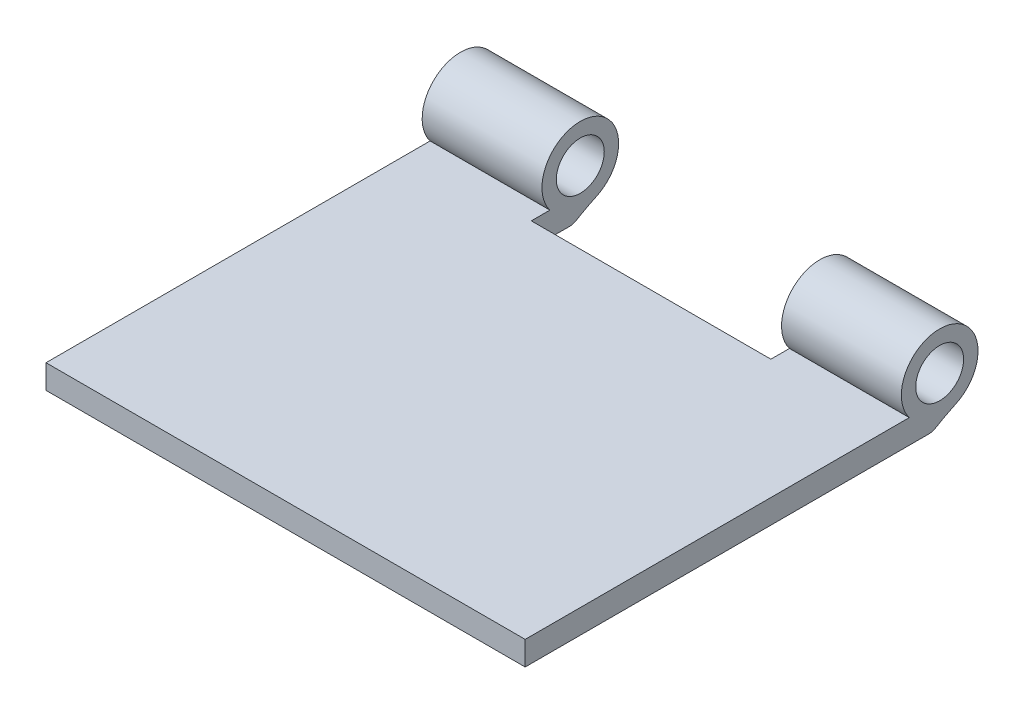
ISO-10303-21;
HEADER;
FILE_DESCRIPTION(('STEP AP214'),'2;1');
FILE_NAME('part.step','',(''),(''),'','','');
FILE_SCHEMA(('AUTOMOTIVE_DESIGN { 1 0 10303 214 1 1 1 1 }'));
ENDSEC;
DATA;
#1=APPLICATION_CONTEXT('core data for automotive mechanical design processes');
#2=APPLICATION_PROTOCOL_DEFINITION('international standard','automotive_design',2000,#1);
#3=PRODUCT_CONTEXT('',#1,'mechanical');
#4=PRODUCT('Part','Part','',(#3));
#5=PRODUCT_RELATED_PRODUCT_CATEGORY('part','',(#4));
#6=PRODUCT_DEFINITION_FORMATION('','',#4);
#7=PRODUCT_DEFINITION_CONTEXT('part definition',#1,'design');
#8=PRODUCT_DEFINITION('design','',#6,#7);
#9=PRODUCT_DEFINITION_SHAPE('','',#8);
#10=(LENGTH_UNIT() NAMED_UNIT(*) SI_UNIT(.MILLI.,.METRE.));
#11=(NAMED_UNIT(*) PLANE_ANGLE_UNIT() SI_UNIT($,.RADIAN.));
#12=(NAMED_UNIT(*) SI_UNIT($,.STERADIAN.) SOLID_ANGLE_UNIT());
#13=UNCERTAINTY_MEASURE_WITH_UNIT(LENGTH_MEASURE(1.E-05),#10,'distance_accuracy_value','');
#14=(GEOMETRIC_REPRESENTATION_CONTEXT(3) GLOBAL_UNCERTAINTY_ASSIGNED_CONTEXT((#13)) GLOBAL_UNIT_ASSIGNED_CONTEXT((#10,
#11,#12)) REPRESENTATION_CONTEXT('',''));
#15=CARTESIAN_POINT('',(0.,0.,0.));
#16=DIRECTION('',(0.,0.,1.));
#17=DIRECTION('',(1.,0.,0.));
#18=AXIS2_PLACEMENT_3D('',#15,#16,#17);
#19=CARTESIAN_POINT('',(0.,1.,0.));
#20=DIRECTION('',(0.,1.,0.));
#21=DIRECTION('',(0.,0.,1.));
#22=AXIS2_PLACEMENT_3D('',#19,#20,#21);
#23=PLANE('',#22);
#24=DIRECTION('',(1.,0.,0.));
#25=VECTOR('',#24,1.);
#26=CARTESIAN_POINT('',(-10.,1.,-7.53132478332535));
#27=LINE('',#26,#25);
#28=CARTESIAN_POINT('',(5.,1.,-7.53132478332535));
#29=VERTEX_POINT('',#28);
#30=CARTESIAN_POINT('',(10.,1.,-7.53132478332535));
#31=VERTEX_POINT('',#30);
#32=EDGE_CURVE('E200',#29,#31,#27,.T.);
#33=ORIENTED_EDGE('',*,*,#32,.F.);
#34=DIRECTION('',(0.,0.,1.));
#35=VECTOR('',#34,1.);
#36=CARTESIAN_POINT('',(5.,1.,0.));
#37=LINE('',#36,#35);
#38=CARTESIAN_POINT('',(5.,1.,-6.75512467054226));
#39=VERTEX_POINT('',#38);
#40=EDGE_CURVE('E162',#29,#39,#37,.T.);
#41=ORIENTED_EDGE('',*,*,#40,.T.);
#42=DIRECTION('',(-1.,0.,0.));
#43=VECTOR('',#42,1.);
#44=CARTESIAN_POINT('',(0.,1.,-6.75512467054226));
#45=LINE('',#44,#43);
#46=CARTESIAN_POINT('',(-5.,1.,-6.75512467054226));
#47=VERTEX_POINT('',#46);
#48=EDGE_CURVE('E168',#39,#47,#45,.T.);
#49=ORIENTED_EDGE('',*,*,#48,.T.);
#50=DIRECTION('',(0.,0.,-1.));
#51=VECTOR('',#50,1.);
#52=CARTESIAN_POINT('',(-5.,1.,0.));
#53=LINE('',#52,#51);
#54=CARTESIAN_POINT('',(-5.,1.,-7.53132478332535));
#55=VERTEX_POINT('',#54);
#56=EDGE_CURVE('E127',#47,#55,#53,.T.);
#57=ORIENTED_EDGE('',*,*,#56,.T.);
#58=CARTESIAN_POINT('',(-10.,1.,-7.53132478332535));
#59=VERTEX_POINT('',#58);
#60=EDGE_CURVE('E201',#59,#55,#27,.T.);
#61=ORIENTED_EDGE('',*,*,#60,.F.);
#62=DIRECTION('',(0.,0.,1.));
#63=VECTOR('',#62,1.);
#64=CARTESIAN_POINT('',(-10.,1.,-8.5));
#65=LINE('',#64,#63);
#66=CARTESIAN_POINT('',(-10.,1.,8.5));
#67=VERTEX_POINT('',#66);
#68=EDGE_CURVE('E185',#59,#67,#65,.T.);
#69=ORIENTED_EDGE('',*,*,#68,.T.);
#70=DIRECTION('',(1.,0.,0.));
#71=VECTOR('',#70,1.);
#72=CARTESIAN_POINT('',(-10.,1.,8.5));
#73=LINE('',#72,#71);
#74=CARTESIAN_POINT('',(10.,1.,8.5));
#75=VERTEX_POINT('',#74);
#76=EDGE_CURVE('E188',#67,#75,#73,.T.);
#77=ORIENTED_EDGE('',*,*,#76,.T.);
#78=DIRECTION('',(0.,0.,-1.));
#79=VECTOR('',#78,1.);
#80=CARTESIAN_POINT('',(10.,1.,-8.5));
#81=LINE('',#80,#79);
#82=EDGE_CURVE('E182',#75,#31,#81,.T.);
#83=ORIENTED_EDGE('',*,*,#82,.T.);
#84=EDGE_LOOP('',(#33,#41,#49,#57,#61,#69,#77,#83));
#85=FACE_BOUND('',#84,.T.);
#86=ADVANCED_FACE('F33',(#85),#23,.T.);
#87=CARTESIAN_POINT('',(0.,0.,0.));
#88=DIRECTION('',(0.,1.,0.));
#89=DIRECTION('',(0.,0.,1.));
#90=AXIS2_PLACEMENT_3D('',#87,#88,#89);
#91=PLANE('',#90);
#92=DIRECTION('',(0.,0.,-1.));
#93=VECTOR('',#92,1.);
#94=CARTESIAN_POINT('',(5.,0.,-16.859859008201));
#95=LINE('',#94,#93);
#96=CARTESIAN_POINT('',(5.,0.,-6.75512467054226));
#97=VERTEX_POINT('',#96);
#98=CARTESIAN_POINT('',(5.,0.,-8.361263217668));
#99=VERTEX_POINT('',#98);
#100=EDGE_CURVE('E144',#97,#99,#95,.T.);
#101=ORIENTED_EDGE('',*,*,#100,.T.);
#102=DIRECTION('',(-1.,0.,0.));
#103=VECTOR('',#102,1.);
#104=CARTESIAN_POINT('',(0.,0.,-8.361263217668));
#105=LINE('',#104,#103);
#106=CARTESIAN_POINT('',(10.,0.,-8.361263217668));
#107=VERTEX_POINT('',#106);
#108=EDGE_CURVE('E56',#99,#107,#105,.F.);
#109=ORIENTED_EDGE('',*,*,#108,.T.);
#110=DIRECTION('',(0.,0.,-1.));
#111=VECTOR('',#110,1.);
#112=CARTESIAN_POINT('',(10.,0.,-8.5));
#113=LINE('',#112,#111);
#114=CARTESIAN_POINT('',(10.,0.,8.5));
#115=VERTEX_POINT('',#114);
#116=EDGE_CURVE('E179',#115,#107,#113,.T.);
#117=ORIENTED_EDGE('',*,*,#116,.F.);
#118=DIRECTION('',(1.,0.,0.));
#119=VECTOR('',#118,1.);
#120=CARTESIAN_POINT('',(-10.,0.,8.5));
#121=LINE('',#120,#119);
#122=CARTESIAN_POINT('',(-10.,0.,8.5));
#123=VERTEX_POINT('',#122);
#124=EDGE_CURVE('E186',#123,#115,#121,.T.);
#125=ORIENTED_EDGE('',*,*,#124,.F.);
#126=DIRECTION('',(0.,0.,1.));
#127=VECTOR('',#126,1.);
#128=CARTESIAN_POINT('',(-10.,0.,-8.5));
#129=LINE('',#128,#127);
#130=CARTESIAN_POINT('',(-10.,0.,-8.361263217668));
#131=VERTEX_POINT('',#130);
#132=EDGE_CURVE('E192',#131,#123,#129,.T.);
#133=ORIENTED_EDGE('',*,*,#132,.F.);
#134=CARTESIAN_POINT('',(-5.,0.,-8.361263217668));
#135=VERTEX_POINT('',#134);
#136=EDGE_CURVE('E143',#131,#135,#105,.F.);
#137=ORIENTED_EDGE('',*,*,#136,.T.);
#138=DIRECTION('',(0.,0.,1.));
#139=VECTOR('',#138,1.);
#140=CARTESIAN_POINT('',(-5.,0.,-16.859859008201));
#141=LINE('',#140,#139);
#142=CARTESIAN_POINT('',(-5.,0.,-6.75512467054226));
#143=VERTEX_POINT('',#142);
#144=EDGE_CURVE('E48',#135,#143,#141,.T.);
#145=ORIENTED_EDGE('',*,*,#144,.T.);
#146=DIRECTION('',(1.,0.,0.));
#147=VECTOR('',#146,1.);
#148=CARTESIAN_POINT('',(-5.,0.,-6.75512467054226));
#149=LINE('',#148,#147);
#150=EDGE_CURVE('E134',#143,#97,#149,.T.);
#151=ORIENTED_EDGE('',*,*,#150,.T.);
#152=EDGE_LOOP('',(#101,#109,#117,#125,#133,#137,#145,#151));
#153=FACE_BOUND('',#152,.T.);
#154=ADVANCED_FACE('F140',(#153),#91,.F.);
#155=CARTESIAN_POINT('',(-10.,1.97441698705141,-8.80038409452623));
#156=DIRECTION('',(1.,0.,0.));
#157=DIRECTION('',(0.,0.,-1.));
#158=AXIS2_PLACEMENT_3D('',#155,#156,#157);
#159=CYLINDRICAL_SURFACE('',#158,1.6);
#160=DIRECTION('',(1.,0.,0.));
#161=VECTOR('',#160,1.);
#162=CARTESIAN_POINT('',(-10.,0.524878328822285,-9.47775967594269));
#163=LINE('',#162,#161);
#164=CARTESIAN_POINT('',(10.,0.524878328822284,-9.47775967594269));
#165=VERTEX_POINT('',#164);
#166=CARTESIAN_POINT('',(5.,0.524878328822285,-9.47775967594269));
#167=VERTEX_POINT('',#166);
#168=EDGE_CURVE('E205',#165,#167,#163,.F.);
#169=ORIENTED_EDGE('',*,*,#168,.T.);
#170=CARTESIAN_POINT('',(5.,1.97441698705141,-8.80038409452623));
#171=DIRECTION('',(-1.,0.,0.));
#172=DIRECTION('',(0.,0.,1.));
#173=AXIS2_PLACEMENT_3D('',#170,#171,#172);
#174=CIRCLE('',#173,1.6);
#175=EDGE_CURVE('E159',#167,#29,#174,.F.);
#176=ORIENTED_EDGE('',*,*,#175,.T.);
#177=ORIENTED_EDGE('',*,*,#32,.T.);
#178=CARTESIAN_POINT('',(10.,1.97441698705141,-8.80038409452623));
#179=DIRECTION('',(1.,0.,0.));
#180=DIRECTION('',(0.,0.,-1.));
#181=AXIS2_PLACEMENT_3D('',#178,#179,#180);
#182=CIRCLE('',#181,1.6);
#183=EDGE_CURVE('E174',#165,#31,#182,.T.);
#184=ORIENTED_EDGE('',*,*,#183,.F.);
#185=EDGE_LOOP('',(#169,#176,#177,#184));
#186=FACE_BOUND('',#185,.T.);
#187=ADVANCED_FACE('F259',(#186),#159,.T.);
#188=CARTESIAN_POINT('',(-5.,1.97441698705141,-8.80038409452623));
#189=DIRECTION('',(1.,0.,0.));
#190=DIRECTION('',(0.,0.,-1.));
#191=AXIS2_PLACEMENT_3D('',#188,#189,#190);
#192=CIRCLE('',#191,1.6);
#193=CARTESIAN_POINT('',(-5.,0.524878328822285,-9.47775967594269));
#194=VERTEX_POINT('',#193);
#195=EDGE_CURVE('E151',#55,#194,#192,.F.);
#196=ORIENTED_EDGE('',*,*,#195,.T.);
#197=CARTESIAN_POINT('',(-10.,0.524878328822285,-9.47775967594269));
#198=VERTEX_POINT('',#197);
#199=EDGE_CURVE('E204',#194,#198,#163,.F.);
#200=ORIENTED_EDGE('',*,*,#199,.T.);
#201=CARTESIAN_POINT('',(-10.,1.97441698705141,-8.80038409452623));
#202=DIRECTION('',(1.,0.,0.));
#203=DIRECTION('',(0.,0.,-1.));
#204=AXIS2_PLACEMENT_3D('',#201,#202,#203);
#205=CIRCLE('',#204,1.6);
#206=EDGE_CURVE('E177',#198,#59,#205,.T.);
#207=ORIENTED_EDGE('',*,*,#206,.T.);
#208=ORIENTED_EDGE('',*,*,#60,.T.);
#209=EDGE_LOOP('',(#196,#200,#207,#208));
#210=FACE_BOUND('',#209,.T.);
#211=ADVANCED_FACE('F232',(#210),#159,.T.);
#212=CARTESIAN_POINT('',(-10.,1.97441698705141,-8.80038409452623));
#213=DIRECTION('',(1.,0.,0.));
#214=DIRECTION('',(0.,0.,-1.));
#215=AXIS2_PLACEMENT_3D('',#212,#213,#214);
#216=CYLINDRICAL_SURFACE('',#215,1.);
#217=CARTESIAN_POINT('',(10.,1.97441698705141,-8.80038409452623));
#218=DIRECTION('',(1.,0.,0.));
#219=DIRECTION('',(0.,0.,-1.));
#220=AXIS2_PLACEMENT_3D('',#217,#218,#219);
#221=CIRCLE('',#220,1.);
#222=CARTESIAN_POINT('',(10.,1.97441698705141,-9.80038409452623));
#223=VERTEX_POINT('',#222);
#224=EDGE_CURVE('E170',#223,#223,#221,.T.);
#225=ORIENTED_EDGE('',*,*,#224,.T.);
#226=EDGE_LOOP('',(#225));
#227=FACE_BOUND('',#226,.T.);
#228=CARTESIAN_POINT('',(5.,1.97441698705141,-8.80038409452623));
#229=DIRECTION('',(-1.,0.,0.));
#230=DIRECTION('',(0.,0.,1.));
#231=AXIS2_PLACEMENT_3D('',#228,#229,#230);
#232=CIRCLE('',#231,1.);
#233=CARTESIAN_POINT('',(5.,1.97441698705141,-7.80038409452623));
#234=VERTEX_POINT('',#233);
#235=EDGE_CURVE('E165',#234,#234,#232,.F.);
#236=ORIENTED_EDGE('',*,*,#235,.F.);
#237=EDGE_LOOP('',(#236));
#238=FACE_BOUND('',#237,.T.);
#239=ADVANCED_FACE('F281',(#227,#238),#216,.F.);
#240=CARTESIAN_POINT('',(-10.,1.97441698705141,-8.80038409452623));
#241=DIRECTION('',(1.,0.,0.));
#242=DIRECTION('',(0.,0.,-1.));
#243=AXIS2_PLACEMENT_3D('',#240,#241,#242);
#244=CIRCLE('',#243,1.);
#245=CARTESIAN_POINT('',(-10.,1.97441698705141,-9.80038409452623));
#246=VERTEX_POINT('',#245);
#247=EDGE_CURVE('E171',#246,#246,#244,.T.);
#248=ORIENTED_EDGE('',*,*,#247,.F.);
#249=EDGE_LOOP('',(#248));
#250=FACE_BOUND('',#249,.T.);
#251=CARTESIAN_POINT('',(-5.,1.97441698705141,-8.80038409452623));
#252=DIRECTION('',(1.,0.,0.));
#253=DIRECTION('',(0.,0.,-1.));
#254=AXIS2_PLACEMENT_3D('',#251,#252,#253);
#255=CIRCLE('',#254,1.);
#256=CARTESIAN_POINT('',(-5.,1.97441698705141,-9.80038409452623));
#257=VERTEX_POINT('',#256);
#258=EDGE_CURVE('E154',#257,#257,#255,.F.);
#259=ORIENTED_EDGE('',*,*,#258,.F.);
#260=EDGE_LOOP('',(#259));
#261=FACE_BOUND('',#260,.T.);
#262=ADVANCED_FACE('F283',(#250,#261),#216,.F.);
#263=CARTESIAN_POINT('',(-10.,-8.53473828510978,-13.7113570597956));
#264=DIRECTION('',(-1.,0.,0.));
#265=DIRECTION('',(0.,0.,1.));
#266=AXIS2_PLACEMENT_3D('',#263,#264,#265);
#267=CYLINDRICAL_SURFACE('',#266,10.);
#268=CARTESIAN_POINT('',(5.,-8.53473828510978,-13.7113570597956));
#269=DIRECTION('',(-1.,0.,0.));
#270=DIRECTION('',(0.,0.,1.));
#271=AXIS2_PLACEMENT_3D('',#268,#269,#270);
#272=CIRCLE('',#271,10.);
#273=CARTESIAN_POINT('',(5.,0.0697743673757254,-8.61602959110265));
#274=VERTEX_POINT('',#273);
#275=EDGE_CURVE('E157',#167,#274,#272,.F.);
#276=ORIENTED_EDGE('',*,*,#275,.F.);
#277=ORIENTED_EDGE('',*,*,#168,.F.);
#278=CARTESIAN_POINT('',(10.,-8.53473828510978,-13.7113570597956));
#279=DIRECTION('',(-1.,0.,0.));
#280=DIRECTION('',(0.,0.,1.));
#281=AXIS2_PLACEMENT_3D('',#278,#279,#280);
#282=CIRCLE('',#281,10.);
#283=CARTESIAN_POINT('',(10.,0.0697743673757252,-8.61602959110265));
#284=VERTEX_POINT('',#283);
#285=EDGE_CURVE('E208',#284,#165,#282,.T.);
#286=ORIENTED_EDGE('',*,*,#285,.F.);
#287=DIRECTION('',(-1.,0.,0.));
#288=VECTOR('',#287,1.);
#289=CARTESIAN_POINT('',(-10.,0.0697743673757252,-8.61602959110265));
#290=LINE('',#289,#288);
#291=EDGE_CURVE('E214',#284,#274,#290,.T.);
#292=ORIENTED_EDGE('',*,*,#291,.T.);
#293=EDGE_LOOP('',(#276,#277,#286,#292));
#294=FACE_BOUND('',#293,.T.);
#295=ADVANCED_FACE('F257',(#294),#267,.F.);
#296=CARTESIAN_POINT('',(-5.,-8.53473828510978,-13.7113570597956));
#297=DIRECTION('',(1.,0.,0.));
#298=DIRECTION('',(0.,0.,-1.));
#299=AXIS2_PLACEMENT_3D('',#296,#297,#298);
#300=CIRCLE('',#299,10.);
#301=CARTESIAN_POINT('',(-5.,0.0697743673757254,-8.61602959110265));
#302=VERTEX_POINT('',#301);
#303=EDGE_CURVE('E130',#302,#194,#300,.F.);
#304=ORIENTED_EDGE('',*,*,#303,.F.);
#305=CARTESIAN_POINT('',(-10.,0.0697743673757252,-8.61602959110265));
#306=VERTEX_POINT('',#305);
#307=EDGE_CURVE('E213',#302,#306,#290,.T.);
#308=ORIENTED_EDGE('',*,*,#307,.T.);
#309=CARTESIAN_POINT('',(-10.,-8.53473828510978,-13.7113570597956));
#310=DIRECTION('',(1.,0.,0.));
#311=DIRECTION('',(0.,0.,-1.));
#312=AXIS2_PLACEMENT_3D('',#309,#310,#311);
#313=CIRCLE('',#312,10.);
#314=EDGE_CURVE('E210',#198,#306,#313,.T.);
#315=ORIENTED_EDGE('',*,*,#314,.F.);
#316=ORIENTED_EDGE('',*,*,#199,.F.);
#317=EDGE_LOOP('',(#304,#308,#315,#316));
#318=FACE_BOUND('',#317,.T.);
#319=ADVANCED_FACE('F228',(#318),#267,.F.);
#320=CARTESIAN_POINT('',(-10.,0.5,-8.361263217668));
#321=DIRECTION('',(-1.,0.,0.));
#322=DIRECTION('',(0.,0.,1.));
#323=AXIS2_PLACEMENT_3D('',#320,#321,#322);
#324=CYLINDRICAL_SURFACE('',#323,0.5);
#325=ORIENTED_EDGE('',*,*,#108,.F.);
#326=CARTESIAN_POINT('',(5.,0.5,-8.361263217668));
#327=DIRECTION('',(-1.,0.,0.));
#328=DIRECTION('',(0.,0.,1.));
#329=AXIS2_PLACEMENT_3D('',#326,#327,#328);
#330=CIRCLE('',#329,0.5);
#331=EDGE_CURVE('E11',#99,#274,#330,.F.);
#332=ORIENTED_EDGE('',*,*,#331,.T.);
#333=ORIENTED_EDGE('',*,*,#291,.F.);
#334=CARTESIAN_POINT('',(10.,0.5,-8.361263217668));
#335=DIRECTION('',(-1.,0.,0.));
#336=DIRECTION('',(0.,0.,1.));
#337=AXIS2_PLACEMENT_3D('',#334,#335,#336);
#338=CIRCLE('',#337,0.5);
#339=EDGE_CURVE('E220',#107,#284,#338,.F.);
#340=ORIENTED_EDGE('',*,*,#339,.F.);
#341=EDGE_LOOP('',(#325,#332,#333,#340));
#342=FACE_BOUND('',#341,.T.);
#343=ADVANCED_FACE('F35',(#342),#324,.T.);
#344=ORIENTED_EDGE('',*,*,#307,.F.);
#345=CARTESIAN_POINT('',(-5.,0.5,-8.361263217668));
#346=DIRECTION('',(1.,0.,0.));
#347=DIRECTION('',(0.,0.,-1.));
#348=AXIS2_PLACEMENT_3D('',#345,#346,#347);
#349=CIRCLE('',#348,0.5);
#350=EDGE_CURVE('E41',#302,#135,#349,.F.);
#351=ORIENTED_EDGE('',*,*,#350,.T.);
#352=ORIENTED_EDGE('',*,*,#136,.F.);
#353=CARTESIAN_POINT('',(-10.,0.5,-8.361263217668));
#354=DIRECTION('',(1.,0.,0.));
#355=DIRECTION('',(0.,0.,-1.));
#356=AXIS2_PLACEMENT_3D('',#353,#354,#355);
#357=CIRCLE('',#356,0.5);
#358=EDGE_CURVE('E217',#306,#131,#357,.F.);
#359=ORIENTED_EDGE('',*,*,#358,.F.);
#360=EDGE_LOOP('',(#344,#351,#352,#359));
#361=FACE_BOUND('',#360,.T.);
#362=ADVANCED_FACE('F223',(#361),#324,.T.);
#363=CARTESIAN_POINT('',(10.,1.,-8.5));
#364=DIRECTION('',(-1.,0.,0.));
#365=DIRECTION('',(0.,0.,1.));
#366=AXIS2_PLACEMENT_3D('',#363,#364,#365);
#367=PLANE('',#366);
#368=ORIENTED_EDGE('',*,*,#116,.T.);
#369=ORIENTED_EDGE('',*,*,#339,.T.);
#370=ORIENTED_EDGE('',*,*,#285,.T.);
#371=ORIENTED_EDGE('',*,*,#183,.T.);
#372=ORIENTED_EDGE('',*,*,#82,.F.);
#373=DIRECTION('',(0.,-1.,0.));
#374=VECTOR('',#373,1.);
#375=CARTESIAN_POINT('',(10.,1.,8.5));
#376=LINE('',#375,#374);
#377=EDGE_CURVE('E190',#75,#115,#376,.T.);
#378=ORIENTED_EDGE('',*,*,#377,.T.);
#379=EDGE_LOOP('',(#368,#369,#370,#371,#372,#378));
#380=FACE_BOUND('',#379,.T.);
#381=ORIENTED_EDGE('',*,*,#224,.F.);
#382=EDGE_LOOP('',(#381));
#383=FACE_BOUND('',#382,.T.);
#384=ADVANCED_FACE('F251',(#380,#383),#367,.F.);
#385=CARTESIAN_POINT('',(-10.,1.,-8.5));
#386=DIRECTION('',(1.,0.,0.));
#387=DIRECTION('',(0.,0.,-1.));
#388=AXIS2_PLACEMENT_3D('',#385,#386,#387);
#389=PLANE('',#388);
#390=ORIENTED_EDGE('',*,*,#314,.T.);
#391=ORIENTED_EDGE('',*,*,#358,.T.);
#392=ORIENTED_EDGE('',*,*,#132,.T.);
#393=DIRECTION('',(0.,-1.,0.));
#394=VECTOR('',#393,1.);
#395=CARTESIAN_POINT('',(-10.,1.,8.5));
#396=LINE('',#395,#394);
#397=EDGE_CURVE('E197',#67,#123,#396,.T.);
#398=ORIENTED_EDGE('',*,*,#397,.F.);
#399=ORIENTED_EDGE('',*,*,#68,.F.);
#400=ORIENTED_EDGE('',*,*,#206,.F.);
#401=EDGE_LOOP('',(#390,#391,#392,#398,#399,#400));
#402=FACE_BOUND('',#401,.T.);
#403=ORIENTED_EDGE('',*,*,#247,.T.);
#404=EDGE_LOOP('',(#403));
#405=FACE_BOUND('',#404,.T.);
#406=ADVANCED_FACE('F236',(#402,#405),#389,.F.);
#407=CARTESIAN_POINT('',(-10.,1.,8.5));
#408=DIRECTION('',(0.,0.,-1.));
#409=DIRECTION('',(-1.,0.,0.));
#410=AXIS2_PLACEMENT_3D('',#407,#408,#409);
#411=PLANE('',#410);
#412=ORIENTED_EDGE('',*,*,#124,.T.);
#413=ORIENTED_EDGE('',*,*,#377,.F.);
#414=ORIENTED_EDGE('',*,*,#76,.F.);
#415=ORIENTED_EDGE('',*,*,#397,.T.);
#416=EDGE_LOOP('',(#412,#413,#414,#415));
#417=FACE_BOUND('',#416,.T.);
#418=ADVANCED_FACE('F263',(#417),#411,.F.);
#419=CARTESIAN_POINT('',(5.,3.57441698705142,-16.859859008201));
#420=DIRECTION('',(-1.,0.,0.));
#421=DIRECTION('',(0.,0.,1.));
#422=AXIS2_PLACEMENT_3D('',#419,#420,#421);
#423=PLANE('',#422);
#424=ORIENTED_EDGE('',*,*,#175,.F.);
#425=ORIENTED_EDGE('',*,*,#275,.T.);
#426=ORIENTED_EDGE('',*,*,#331,.F.);
#427=ORIENTED_EDGE('',*,*,#100,.F.);
#428=DIRECTION('',(0.,-1.,0.));
#429=VECTOR('',#428,1.);
#430=CARTESIAN_POINT('',(5.,3.57441698705142,-6.75512467054226));
#431=LINE('',#430,#429);
#432=EDGE_CURVE('E131',#39,#97,#431,.T.);
#433=ORIENTED_EDGE('',*,*,#432,.F.);
#434=ORIENTED_EDGE('',*,*,#40,.F.);
#435=EDGE_LOOP('',(#424,#425,#426,#427,#433,#434));
#436=FACE_BOUND('',#435,.T.);
#437=ORIENTED_EDGE('',*,*,#235,.T.);
#438=EDGE_LOOP('',(#437));
#439=FACE_BOUND('',#438,.T.);
#440=ADVANCED_FACE('F244',(#436,#439),#423,.T.);
#441=CARTESIAN_POINT('',(-5.,3.57441698705142,-16.859859008201));
#442=DIRECTION('',(1.,0.,0.));
#443=DIRECTION('',(0.,0.,-1.));
#444=AXIS2_PLACEMENT_3D('',#441,#442,#443);
#445=PLANE('',#444);
#446=DIRECTION('',(0.,-1.,0.));
#447=VECTOR('',#446,1.);
#448=CARTESIAN_POINT('',(-5.,3.57441698705142,-6.75512467054226));
#449=LINE('',#448,#447);
#450=EDGE_CURVE('E122',#47,#143,#449,.T.);
#451=ORIENTED_EDGE('',*,*,#450,.T.);
#452=ORIENTED_EDGE('',*,*,#144,.F.);
#453=ORIENTED_EDGE('',*,*,#350,.F.);
#454=ORIENTED_EDGE('',*,*,#303,.T.);
#455=ORIENTED_EDGE('',*,*,#195,.F.);
#456=ORIENTED_EDGE('',*,*,#56,.F.);
#457=EDGE_LOOP('',(#451,#452,#453,#454,#455,#456));
#458=FACE_BOUND('',#457,.T.);
#459=ORIENTED_EDGE('',*,*,#258,.T.);
#460=EDGE_LOOP('',(#459));
#461=FACE_BOUND('',#460,.T.);
#462=ADVANCED_FACE('F124',(#458,#461),#445,.T.);
#463=CARTESIAN_POINT('',(-5.,3.57441698705142,-6.75512467054226));
#464=DIRECTION('',(0.,0.,-1.));
#465=DIRECTION('',(-1.,0.,0.));
#466=AXIS2_PLACEMENT_3D('',#463,#464,#465);
#467=PLANE('',#466);
#468=ORIENTED_EDGE('',*,*,#432,.T.);
#469=ORIENTED_EDGE('',*,*,#150,.F.);
#470=ORIENTED_EDGE('',*,*,#450,.F.);
#471=ORIENTED_EDGE('',*,*,#48,.F.);
#472=EDGE_LOOP('',(#468,#469,#470,#471));
#473=FACE_BOUND('',#472,.T.);
#474=ADVANCED_FACE('F135',(#473),#467,.T.);
#475=CLOSED_SHELL('',(#86,#154,#187,#211,#239,#262,#295,#319,#343,#362,#384,#406,#418,#440,#462,#474));
#476=MANIFOLD_SOLID_BREP('B2',#475);
#477=ADVANCED_BREP_SHAPE_REPRESENTATION('',(#18,#476),#14);
#478=SHAPE_DEFINITION_REPRESENTATION(#9,#477);
ENDSEC;
END-ISO-10303-21;
